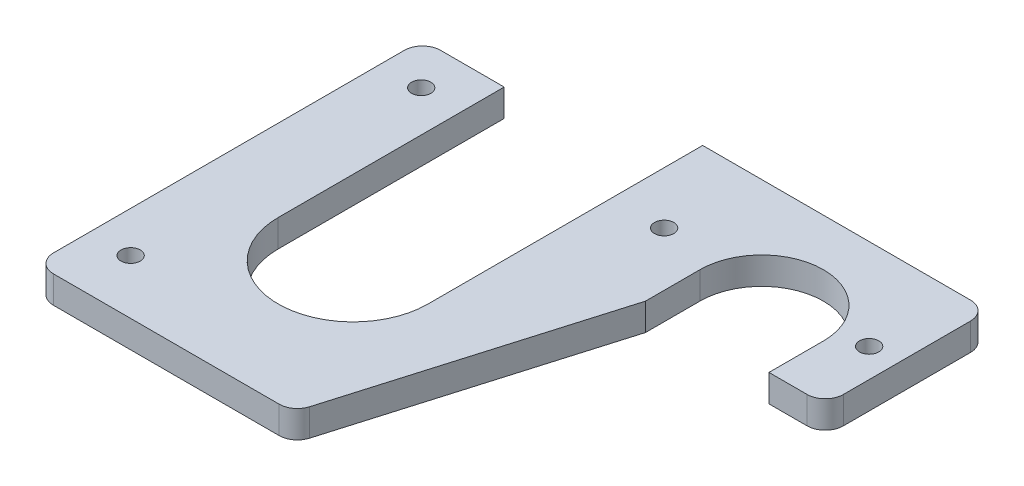
ISO-10303-21;
HEADER;
FILE_DESCRIPTION(('STEP AP214'),'2;1');
FILE_NAME('part.step','',(''),(''),'','','');
FILE_SCHEMA(('AUTOMOTIVE_DESIGN { 1 0 10303 214 1 1 1 1 }'));
ENDSEC;
DATA;
#1=APPLICATION_CONTEXT('core data for automotive mechanical design processes');
#2=APPLICATION_PROTOCOL_DEFINITION('international standard','automotive_design',2000,#1);
#3=PRODUCT_CONTEXT('',#1,'mechanical');
#4=PRODUCT('Part','Part','',(#3));
#5=PRODUCT_RELATED_PRODUCT_CATEGORY('part','',(#4));
#6=PRODUCT_DEFINITION_FORMATION('','',#4);
#7=PRODUCT_DEFINITION_CONTEXT('part definition',#1,'design');
#8=PRODUCT_DEFINITION('design','',#6,#7);
#9=PRODUCT_DEFINITION_SHAPE('','',#8);
#10=(LENGTH_UNIT() NAMED_UNIT(*) SI_UNIT(.MILLI.,.METRE.));
#11=(NAMED_UNIT(*) PLANE_ANGLE_UNIT() SI_UNIT($,.RADIAN.));
#12=(NAMED_UNIT(*) SI_UNIT($,.STERADIAN.) SOLID_ANGLE_UNIT());
#13=UNCERTAINTY_MEASURE_WITH_UNIT(LENGTH_MEASURE(1.E-05),#10,'distance_accuracy_value','');
#14=(GEOMETRIC_REPRESENTATION_CONTEXT(3) GLOBAL_UNCERTAINTY_ASSIGNED_CONTEXT((#13)) GLOBAL_UNIT_ASSIGNED_CONTEXT((#10,
#11,#12)) REPRESENTATION_CONTEXT('',''));
#15=CARTESIAN_POINT('',(0.,0.,0.));
#16=DIRECTION('',(0.,0.,1.));
#17=DIRECTION('',(1.,0.,0.));
#18=AXIS2_PLACEMENT_3D('',#15,#16,#17);
#19=CARTESIAN_POINT('',(82.55,9.525,0.));
#20=DIRECTION('',(-0.959204567325331,0.,-0.282712925106413));
#21=DIRECTION('',(-0.282712925106413,0.,0.959204567325331));
#22=AXIS2_PLACEMENT_3D('',#19,#20,#21);
#23=PLANE('',#22);
#24=DIRECTION('',(0.282712925106413,0.,-0.959204567325331));
#25=VECTOR('',#24,1.);
#26=CARTESIAN_POINT('',(82.55,9.525,0.));
#27=LINE('',#26,#25);
#28=CARTESIAN_POINT('',(91.378775178064,9.525,-29.9547729255743));
#29=VERTEX_POINT('',#28);
#30=CARTESIAN_POINT('',(118.11,9.525,-120.65));
#31=VERTEX_POINT('',#30);
#32=EDGE_CURVE('E157',#29,#31,#27,.T.);
#33=ORIENTED_EDGE('',*,*,#32,.F.);
#34=DIRECTION('',(0.,-1.,0.));
#35=VECTOR('',#34,1.);
#36=CARTESIAN_POINT('',(91.378775178064,9.525,-29.9547729255743));
#37=LINE('',#36,#35);
#38=CARTESIAN_POINT('',(91.378775178064,0.,-29.9547729255743));
#39=VERTEX_POINT('',#38);
#40=EDGE_CURVE('E285',#29,#39,#37,.T.);
#41=ORIENTED_EDGE('',*,*,#40,.T.);
#42=DIRECTION('',(0.282712925106413,0.,-0.959204567325331));
#43=VECTOR('',#42,1.);
#44=CARTESIAN_POINT('',(82.55,0.,0.));
#45=LINE('',#44,#43);
#46=CARTESIAN_POINT('',(118.11,0.,-120.65));
#47=VERTEX_POINT('',#46);
#48=EDGE_CURVE('E175',#39,#47,#45,.T.);
#49=ORIENTED_EDGE('',*,*,#48,.T.);
#50=DIRECTION('',(0.,-1.,0.));
#51=VECTOR('',#50,1.);
#52=CARTESIAN_POINT('',(118.11,9.525,-120.65));
#53=LINE('',#52,#51);
#54=EDGE_CURVE('E173',#31,#47,#53,.T.);
#55=ORIENTED_EDGE('',*,*,#54,.F.);
#56=EDGE_LOOP('',(#33,#41,#49,#55));
#57=FACE_BOUND('',#56,.T.);
#58=ADVANCED_FACE('F33',(#57),#23,.F.);
#59=CARTESIAN_POINT('',(118.11,9.525,-139.7));
#60=DIRECTION('',(-1.,0.,0.));
#61=DIRECTION('',(0.,0.,1.));
#62=AXIS2_PLACEMENT_3D('',#59,#60,#61);
#63=PLANE('',#62);
#64=DIRECTION('',(0.,0.,-1.));
#65=VECTOR('',#64,1.);
#66=CARTESIAN_POINT('',(118.11,0.,-139.7));
#67=LINE('',#66,#65);
#68=CARTESIAN_POINT('',(118.11,0.,-139.7));
#69=VERTEX_POINT('',#68);
#70=EDGE_CURVE('E209',#47,#69,#67,.T.);
#71=ORIENTED_EDGE('',*,*,#70,.T.);
#72=DIRECTION('',(0.,-1.,0.));
#73=VECTOR('',#72,1.);
#74=CARTESIAN_POINT('',(118.11,9.525,-139.7));
#75=LINE('',#74,#73);
#76=CARTESIAN_POINT('',(118.11,9.525,-139.7));
#77=VERTEX_POINT('',#76);
#78=EDGE_CURVE('E179',#77,#69,#75,.T.);
#79=ORIENTED_EDGE('',*,*,#78,.F.);
#80=DIRECTION('',(0.,0.,-1.));
#81=VECTOR('',#80,1.);
#82=CARTESIAN_POINT('',(118.11,9.525,-139.7));
#83=LINE('',#82,#81);
#84=EDGE_CURVE('E162',#31,#77,#83,.T.);
#85=ORIENTED_EDGE('',*,*,#84,.F.);
#86=ORIENTED_EDGE('',*,*,#54,.T.);
#87=EDGE_LOOP('',(#71,#79,#85,#86));
#88=FACE_BOUND('',#87,.T.);
#89=ADVANCED_FACE('F181',(#88),#63,.F.);
#90=CARTESIAN_POINT('',(139.7,9.525,-139.7));
#91=DIRECTION('',(0.,-1.,0.));
#92=DIRECTION('',(0.,0.,-1.));
#93=AXIS2_PLACEMENT_3D('',#90,#91,#92);
#94=CYLINDRICAL_SURFACE('',#93,21.59);
#95=CARTESIAN_POINT('',(139.7,0.,-139.7));
#96=DIRECTION('',(0.,-1.,0.));
#97=DIRECTION('',(0.,0.,1.));
#98=AXIS2_PLACEMENT_3D('',#95,#96,#97);
#99=CIRCLE('',#98,21.59);
#100=CARTESIAN_POINT('',(161.29,0.,-139.7));
#101=VERTEX_POINT('',#100);
#102=EDGE_CURVE('E212',#69,#101,#99,.T.);
#103=ORIENTED_EDGE('',*,*,#102,.T.);
#104=DIRECTION('',(0.,-1.,0.));
#105=VECTOR('',#104,1.);
#106=CARTESIAN_POINT('',(161.29,9.525,-139.7));
#107=LINE('',#106,#105);
#108=CARTESIAN_POINT('',(161.29,9.525,-139.7));
#109=VERTEX_POINT('',#108);
#110=EDGE_CURVE('E247',#109,#101,#107,.T.);
#111=ORIENTED_EDGE('',*,*,#110,.F.);
#112=CARTESIAN_POINT('',(139.7,9.525,-139.7));
#113=DIRECTION('',(0.,-1.,0.));
#114=DIRECTION('',(0.,0.,1.));
#115=AXIS2_PLACEMENT_3D('',#112,#113,#114);
#116=CIRCLE('',#115,21.59);
#117=EDGE_CURVE('E184',#77,#109,#116,.T.);
#118=ORIENTED_EDGE('',*,*,#117,.F.);
#119=ORIENTED_EDGE('',*,*,#78,.T.);
#120=EDGE_LOOP('',(#103,#111,#118,#119));
#121=FACE_BOUND('',#120,.T.);
#122=ADVANCED_FACE('F327',(#121),#94,.F.);
#123=CARTESIAN_POINT('',(161.29,9.525,-139.7));
#124=DIRECTION('',(1.,0.,0.));
#125=DIRECTION('',(0.,0.,-1.));
#126=AXIS2_PLACEMENT_3D('',#123,#124,#125);
#127=PLANE('',#126);
#128=DIRECTION('',(0.,0.,1.));
#129=VECTOR('',#128,1.);
#130=CARTESIAN_POINT('',(161.29,0.,-139.7));
#131=LINE('',#130,#129);
#132=CARTESIAN_POINT('',(161.29,0.,-120.65));
#133=VERTEX_POINT('',#132);
#134=EDGE_CURVE('E214',#101,#133,#131,.T.);
#135=ORIENTED_EDGE('',*,*,#134,.T.);
#136=DIRECTION('',(0.,-1.,0.));
#137=VECTOR('',#136,1.);
#138=CARTESIAN_POINT('',(161.29,9.525,-120.65));
#139=LINE('',#138,#137);
#140=CARTESIAN_POINT('',(161.29,9.525,-120.65));
#141=VERTEX_POINT('',#140);
#142=EDGE_CURVE('E244',#141,#133,#139,.T.);
#143=ORIENTED_EDGE('',*,*,#142,.F.);
#144=DIRECTION('',(0.,0.,1.));
#145=VECTOR('',#144,1.);
#146=CARTESIAN_POINT('',(161.29,9.525,-139.7));
#147=LINE('',#146,#145);
#148=EDGE_CURVE('E186',#109,#141,#147,.T.);
#149=ORIENTED_EDGE('',*,*,#148,.F.);
#150=ORIENTED_EDGE('',*,*,#110,.T.);
#151=EDGE_LOOP('',(#135,#143,#149,#150));
#152=FACE_BOUND('',#151,.T.);
#153=ADVANCED_FACE('F352',(#152),#127,.F.);
#154=CARTESIAN_POINT('',(180.975,9.525,-120.65));
#155=DIRECTION('',(0.,0.,-1.));
#156=DIRECTION('',(-1.,0.,0.));
#157=AXIS2_PLACEMENT_3D('',#154,#155,#156);
#158=PLANE('',#157);
#159=DIRECTION('',(1.,0.,0.));
#160=VECTOR('',#159,1.);
#161=CARTESIAN_POINT('',(180.975,0.,-120.65));
#162=LINE('',#161,#160);
#163=CARTESIAN_POINT('',(174.625,0.,-120.65));
#164=VERTEX_POINT('',#163);
#165=EDGE_CURVE('E216',#133,#164,#162,.T.);
#166=ORIENTED_EDGE('',*,*,#165,.T.);
#167=DIRECTION('',(0.,-1.,0.));
#168=VECTOR('',#167,1.);
#169=CARTESIAN_POINT('',(174.625,9.525,-120.65));
#170=LINE('',#169,#168);
#171=CARTESIAN_POINT('',(174.625,9.525,-120.65));
#172=VERTEX_POINT('',#171);
#173=EDGE_CURVE('E277',#164,#172,#170,.F.);
#174=ORIENTED_EDGE('',*,*,#173,.T.);
#175=DIRECTION('',(1.,0.,0.));
#176=VECTOR('',#175,1.);
#177=CARTESIAN_POINT('',(180.975,9.525,-120.65));
#178=LINE('',#177,#176);
#179=EDGE_CURVE('E191',#141,#172,#178,.T.);
#180=ORIENTED_EDGE('',*,*,#179,.F.);
#181=ORIENTED_EDGE('',*,*,#142,.T.);
#182=EDGE_LOOP('',(#166,#174,#180,#181));
#183=FACE_BOUND('',#182,.T.);
#184=ADVANCED_FACE('F355',(#183),#158,.F.);
#185=CARTESIAN_POINT('',(180.975,9.525,-139.7));
#186=DIRECTION('',(-1.,0.,0.));
#187=DIRECTION('',(0.,0.,1.));
#188=AXIS2_PLACEMENT_3D('',#185,#186,#187);
#189=PLANE('',#188);
#190=DIRECTION('',(0.,0.,-1.));
#191=VECTOR('',#190,1.);
#192=CARTESIAN_POINT('',(180.975,9.525,-139.7));
#193=LINE('',#192,#191);
#194=CARTESIAN_POINT('',(180.975,9.525,-127.));
#195=VERTEX_POINT('',#194);
#196=CARTESIAN_POINT('',(180.975,9.525,-171.45));
#197=VERTEX_POINT('',#196);
#198=EDGE_CURVE('E193',#195,#197,#193,.T.);
#199=ORIENTED_EDGE('',*,*,#198,.F.);
#200=DIRECTION('',(0.,-1.,0.));
#201=VECTOR('',#200,1.);
#202=CARTESIAN_POINT('',(180.975,9.525,-127.));
#203=LINE('',#202,#201);
#204=CARTESIAN_POINT('',(180.975,0.,-127.));
#205=VERTEX_POINT('',#204);
#206=EDGE_CURVE('E266',#195,#205,#203,.T.);
#207=ORIENTED_EDGE('',*,*,#206,.T.);
#208=DIRECTION('',(0.,0.,-1.));
#209=VECTOR('',#208,1.);
#210=CARTESIAN_POINT('',(180.975,0.,-139.7));
#211=LINE('',#210,#209);
#212=CARTESIAN_POINT('',(180.975,0.,-171.45));
#213=VERTEX_POINT('',#212);
#214=EDGE_CURVE('E219',#205,#213,#211,.T.);
#215=ORIENTED_EDGE('',*,*,#214,.T.);
#216=DIRECTION('',(0.,-1.,0.));
#217=VECTOR('',#216,1.);
#218=CARTESIAN_POINT('',(180.975,9.525,-171.45));
#219=LINE('',#218,#217);
#220=EDGE_CURVE('E264',#213,#197,#219,.F.);
#221=ORIENTED_EDGE('',*,*,#220,.T.);
#222=EDGE_LOOP('',(#199,#207,#215,#221));
#223=FACE_BOUND('',#222,.T.);
#224=ADVANCED_FACE('F360',(#223),#189,.F.);
#225=CARTESIAN_POINT('',(80.9625,9.525,-177.8));
#226=DIRECTION('',(0.,0.,1.));
#227=DIRECTION('',(1.,0.,0.));
#228=AXIS2_PLACEMENT_3D('',#225,#226,#227);
#229=PLANE('',#228);
#230=DIRECTION('',(-1.,0.,0.));
#231=VECTOR('',#230,1.);
#232=CARTESIAN_POINT('',(180.975,9.525,-177.8));
#233=LINE('',#232,#231);
#234=CARTESIAN_POINT('',(174.625,9.525,-177.8));
#235=VERTEX_POINT('',#234);
#236=CARTESIAN_POINT('',(80.9625,9.525,-177.8));
#237=VERTEX_POINT('',#236);
#238=EDGE_CURVE('E195',#235,#237,#233,.T.);
#239=ORIENTED_EDGE('',*,*,#238,.F.);
#240=DIRECTION('',(0.,-1.,0.));
#241=VECTOR('',#240,1.);
#242=CARTESIAN_POINT('',(174.625,9.525,-177.8));
#243=LINE('',#242,#241);
#244=CARTESIAN_POINT('',(174.625,0.,-177.8));
#245=VERTEX_POINT('',#244);
#246=EDGE_CURVE('E289',#235,#245,#243,.T.);
#247=ORIENTED_EDGE('',*,*,#246,.T.);
#248=DIRECTION('',(-1.,0.,0.));
#249=VECTOR('',#248,1.);
#250=CARTESIAN_POINT('',(80.9625,0.,-177.8));
#251=LINE('',#250,#249);
#252=CARTESIAN_POINT('',(80.9625,0.,-177.8));
#253=VERTEX_POINT('',#252);
#254=EDGE_CURVE('E222',#245,#253,#251,.T.);
#255=ORIENTED_EDGE('',*,*,#254,.T.);
#256=DIRECTION('',(0.,-1.,0.));
#257=VECTOR('',#256,1.);
#258=CARTESIAN_POINT('',(80.9625,9.525,-177.8));
#259=LINE('',#258,#257);
#260=EDGE_CURVE('E241',#237,#253,#259,.T.);
#261=ORIENTED_EDGE('',*,*,#260,.F.);
#262=EDGE_LOOP('',(#239,#247,#255,#261));
#263=FACE_BOUND('',#262,.T.);
#264=ADVANCED_FACE('F365',(#263),#229,.F.);
#265=CARTESIAN_POINT('',(80.9625,9.525,-81.75625));
#266=DIRECTION('',(1.,0.,0.));
#267=DIRECTION('',(0.,0.,-1.));
#268=AXIS2_PLACEMENT_3D('',#265,#266,#267);
#269=PLANE('',#268);
#270=DIRECTION('',(0.,0.,1.));
#271=VECTOR('',#270,1.);
#272=CARTESIAN_POINT('',(80.9625,0.,-81.75625));
#273=LINE('',#272,#271);
#274=CARTESIAN_POINT('',(80.9625,0.,-81.75625));
#275=VERTEX_POINT('',#274);
#276=EDGE_CURVE('E224',#253,#275,#273,.T.);
#277=ORIENTED_EDGE('',*,*,#276,.T.);
#278=DIRECTION('',(0.,-1.,0.));
#279=VECTOR('',#278,1.);
#280=CARTESIAN_POINT('',(80.9625,9.525,-81.75625));
#281=LINE('',#280,#279);
#282=CARTESIAN_POINT('',(80.9625,9.525,-81.75625));
#283=VERTEX_POINT('',#282);
#284=EDGE_CURVE('E238',#283,#275,#281,.T.);
#285=ORIENTED_EDGE('',*,*,#284,.F.);
#286=DIRECTION('',(0.,0.,1.));
#287=VECTOR('',#286,1.);
#288=CARTESIAN_POINT('',(80.9625,9.525,-81.75625));
#289=LINE('',#288,#287);
#290=EDGE_CURVE('E197',#237,#283,#289,.T.);
#291=ORIENTED_EDGE('',*,*,#290,.F.);
#292=ORIENTED_EDGE('',*,*,#260,.T.);
#293=EDGE_LOOP('',(#277,#285,#291,#292));
#294=FACE_BOUND('',#293,.T.);
#295=ADVANCED_FACE('F372',(#294),#269,.F.);
#296=CARTESIAN_POINT('',(54.76875,9.525,-81.75625));
#297=DIRECTION('',(0.,-1.,0.));
#298=DIRECTION('',(0.,0.,-1.));
#299=AXIS2_PLACEMENT_3D('',#296,#297,#298);
#300=CYLINDRICAL_SURFACE('',#299,26.19375);
#301=CARTESIAN_POINT('',(54.76875,0.,-81.75625));
#302=DIRECTION('',(0.,-1.,0.));
#303=DIRECTION('',(0.,0.,1.));
#304=AXIS2_PLACEMENT_3D('',#301,#302,#303);
#305=CIRCLE('',#304,26.19375);
#306=CARTESIAN_POINT('',(28.575,0.,-81.75625));
#307=VERTEX_POINT('',#306);
#308=EDGE_CURVE('E226',#275,#307,#305,.T.);
#309=ORIENTED_EDGE('',*,*,#308,.T.);
#310=DIRECTION('',(0.,-1.,0.));
#311=VECTOR('',#310,1.);
#312=CARTESIAN_POINT('',(28.575,9.525,-81.75625));
#313=LINE('',#312,#311);
#314=CARTESIAN_POINT('',(28.575,9.525,-81.75625));
#315=VERTEX_POINT('',#314);
#316=EDGE_CURVE('E235',#315,#307,#313,.T.);
#317=ORIENTED_EDGE('',*,*,#316,.F.);
#318=CARTESIAN_POINT('',(54.76875,9.525,-81.75625));
#319=DIRECTION('',(0.,-1.,0.));
#320=DIRECTION('',(0.,0.,1.));
#321=AXIS2_PLACEMENT_3D('',#318,#319,#320);
#322=CIRCLE('',#321,26.19375);
#323=EDGE_CURVE('E199',#283,#315,#322,.T.);
#324=ORIENTED_EDGE('',*,*,#323,.F.);
#325=ORIENTED_EDGE('',*,*,#284,.T.);
#326=EDGE_LOOP('',(#309,#317,#324,#325));
#327=FACE_BOUND('',#326,.T.);
#328=ADVANCED_FACE('F376',(#327),#300,.F.);
#329=CARTESIAN_POINT('',(28.575,9.525,-81.75625));
#330=DIRECTION('',(-1.,0.,0.));
#331=DIRECTION('',(0.,0.,1.));
#332=AXIS2_PLACEMENT_3D('',#329,#330,#331);
#333=PLANE('',#332);
#334=DIRECTION('',(0.,0.,-1.));
#335=VECTOR('',#334,1.);
#336=CARTESIAN_POINT('',(28.575,0.,-81.75625));
#337=LINE('',#336,#335);
#338=CARTESIAN_POINT('',(28.575,0.,-160.782));
#339=VERTEX_POINT('',#338);
#340=EDGE_CURVE('E228',#307,#339,#337,.T.);
#341=ORIENTED_EDGE('',*,*,#340,.T.);
#342=DIRECTION('',(0.,-1.,0.));
#343=VECTOR('',#342,1.);
#344=CARTESIAN_POINT('',(28.575,9.525,-160.782));
#345=LINE('',#344,#343);
#346=CARTESIAN_POINT('',(28.575,9.525,-160.782));
#347=VERTEX_POINT('',#346);
#348=EDGE_CURVE('E207',#347,#339,#345,.T.);
#349=ORIENTED_EDGE('',*,*,#348,.F.);
#350=DIRECTION('',(0.,0.,-1.));
#351=VECTOR('',#350,1.);
#352=CARTESIAN_POINT('',(28.575,9.525,-81.75625));
#353=LINE('',#352,#351);
#354=EDGE_CURVE('E201',#315,#347,#353,.T.);
#355=ORIENTED_EDGE('',*,*,#354,.F.);
#356=ORIENTED_EDGE('',*,*,#316,.T.);
#357=EDGE_LOOP('',(#341,#349,#355,#356));
#358=FACE_BOUND('',#357,.T.);
#359=ADVANCED_FACE('F381',(#358),#333,.F.);
#360=CARTESIAN_POINT('',(0.,9.525,-160.782));
#361=DIRECTION('',(0.,0.,1.));
#362=DIRECTION('',(1.,0.,0.));
#363=AXIS2_PLACEMENT_3D('',#360,#361,#362);
#364=PLANE('',#363);
#365=DIRECTION('',(-1.,0.,0.));
#366=VECTOR('',#365,1.);
#367=CARTESIAN_POINT('',(0.,0.,-160.782));
#368=LINE('',#367,#366);
#369=CARTESIAN_POINT('',(6.35,0.,-160.782));
#370=VERTEX_POINT('',#369);
#371=EDGE_CURVE('E230',#339,#370,#368,.T.);
#372=ORIENTED_EDGE('',*,*,#371,.T.);
#373=DIRECTION('',(0.,-1.,0.));
#374=VECTOR('',#373,1.);
#375=CARTESIAN_POINT('',(6.35,9.525,-160.782));
#376=LINE('',#375,#374);
#377=CARTESIAN_POINT('',(6.35,9.525,-160.782));
#378=VERTEX_POINT('',#377);
#379=EDGE_CURVE('E11',#370,#378,#376,.F.);
#380=ORIENTED_EDGE('',*,*,#379,.T.);
#381=DIRECTION('',(-1.,0.,0.));
#382=VECTOR('',#381,1.);
#383=CARTESIAN_POINT('',(0.,9.525,-160.782));
#384=LINE('',#383,#382);
#385=EDGE_CURVE('E203',#347,#378,#384,.T.);
#386=ORIENTED_EDGE('',*,*,#385,.F.);
#387=ORIENTED_EDGE('',*,*,#348,.T.);
#388=EDGE_LOOP('',(#372,#380,#386,#387));
#389=FACE_BOUND('',#388,.T.);
#390=ADVANCED_FACE('F382',(#389),#364,.F.);
#391=CARTESIAN_POINT('',(0.,9.525,-160.782));
#392=DIRECTION('',(1.,0.,0.));
#393=DIRECTION('',(0.,0.,-1.));
#394=AXIS2_PLACEMENT_3D('',#391,#392,#393);
#395=PLANE('',#394);
#396=DIRECTION('',(0.,0.,1.));
#397=VECTOR('',#396,1.);
#398=CARTESIAN_POINT('',(0.,9.525,-160.782));
#399=LINE('',#398,#397);
#400=CARTESIAN_POINT('',(0.,9.525,-154.432));
#401=VERTEX_POINT('',#400);
#402=CARTESIAN_POINT('',(0.,9.525,-31.75));
#403=VERTEX_POINT('',#402);
#404=EDGE_CURVE('E205',#401,#403,#399,.T.);
#405=ORIENTED_EDGE('',*,*,#404,.F.);
#406=DIRECTION('',(0.,-1.,0.));
#407=VECTOR('',#406,1.);
#408=CARTESIAN_POINT('',(0.,9.525,-154.432));
#409=LINE('',#408,#407);
#410=CARTESIAN_POINT('',(0.,0.,-154.432));
#411=VERTEX_POINT('',#410);
#412=EDGE_CURVE('E41',#401,#411,#409,.T.);
#413=ORIENTED_EDGE('',*,*,#412,.T.);
#414=DIRECTION('',(0.,0.,1.));
#415=VECTOR('',#414,1.);
#416=CARTESIAN_POINT('',(0.,0.,-160.782));
#417=LINE('',#416,#415);
#418=CARTESIAN_POINT('',(0.,0.,-31.75));
#419=VERTEX_POINT('',#418);
#420=EDGE_CURVE('E170',#411,#419,#417,.T.);
#421=ORIENTED_EDGE('',*,*,#420,.T.);
#422=DIRECTION('',(0.,1.,0.));
#423=VECTOR('',#422,1.);
#424=CARTESIAN_POINT('',(0.,9.525,-31.75));
#425=LINE('',#424,#423);
#426=EDGE_CURVE('E252',#419,#403,#425,.T.);
#427=ORIENTED_EDGE('',*,*,#426,.T.);
#428=EDGE_LOOP('',(#405,#413,#421,#427));
#429=FACE_BOUND('',#428,.T.);
#430=ADVANCED_FACE('F296',(#429),#395,.F.);
#431=CARTESIAN_POINT('',(139.7,9.525,-139.7));
#432=DIRECTION('',(0.,1.,0.));
#433=DIRECTION('',(0.,0.,1.));
#434=AXIS2_PLACEMENT_3D('',#431,#432,#433);
#435=PLANE('',#434);
#436=CARTESIAN_POINT('',(14.2875,9.525,-146.05));
#437=DIRECTION('',(0.,1.,0.));
#438=DIRECTION('',(0.,0.,1.));
#439=AXIS2_PLACEMENT_3D('',#436,#437,#438);
#440=CIRCLE('',#439,3.37819999999999);
#441=CARTESIAN_POINT('',(14.2875,9.525,-142.6718));
#442=VERTEX_POINT('',#441);
#443=EDGE_CURVE('E581',#442,#442,#440,.T.);
#444=ORIENTED_EDGE('',*,*,#443,.F.);
#445=EDGE_LOOP('',(#444));
#446=FACE_BOUND('',#445,.T.);
#447=CARTESIAN_POINT('',(14.2875,9.525,-44.45));
#448=DIRECTION('',(0.,1.,0.));
#449=DIRECTION('',(0.,0.,1.));
#450=AXIS2_PLACEMENT_3D('',#447,#448,#449);
#451=CIRCLE('',#450,3.37819999999999);
#452=CARTESIAN_POINT('',(14.2875,9.525,-41.0718));
#453=VERTEX_POINT('',#452);
#454=EDGE_CURVE('E575',#453,#453,#451,.T.);
#455=ORIENTED_EDGE('',*,*,#454,.F.);
#456=EDGE_LOOP('',(#455));
#457=FACE_BOUND('',#456,.T.);
#458=CARTESIAN_POINT('',(99.2378,9.525,-146.05));
#459=DIRECTION('',(0.,1.,0.));
#460=DIRECTION('',(0.,0.,1.));
#461=AXIS2_PLACEMENT_3D('',#458,#459,#460);
#462=CIRCLE('',#461,3.37819999999998);
#463=CARTESIAN_POINT('',(99.2378,9.525,-142.6718));
#464=VERTEX_POINT('',#463);
#465=EDGE_CURVE('E569',#464,#464,#462,.T.);
#466=ORIENTED_EDGE('',*,*,#465,.F.);
#467=EDGE_LOOP('',(#466));
#468=FACE_BOUND('',#467,.T.);
#469=CARTESIAN_POINT('',(170.92295,9.525,-146.05));
#470=DIRECTION('',(0.,1.,0.));
#471=DIRECTION('',(0.,0.,1.));
#472=AXIS2_PLACEMENT_3D('',#469,#470,#471);
#473=CIRCLE('',#472,3.3782);
#474=CARTESIAN_POINT('',(170.92295,9.525,-142.6718));
#475=VERTEX_POINT('',#474);
#476=EDGE_CURVE('E561',#475,#475,#473,.T.);
#477=ORIENTED_EDGE('',*,*,#476,.F.);
#478=EDGE_LOOP('',(#477));
#479=FACE_BOUND('',#478,.T.);
#480=ORIENTED_EDGE('',*,*,#179,.T.);
#481=CARTESIAN_POINT('',(174.625,9.525,-127.));
#482=DIRECTION('',(0.,1.,0.));
#483=DIRECTION('',(0.,0.,1.));
#484=AXIS2_PLACEMENT_3D('',#481,#482,#483);
#485=CIRCLE('',#484,6.35);
#486=EDGE_CURVE('E283',#172,#195,#485,.T.);
#487=ORIENTED_EDGE('',*,*,#486,.T.);
#488=ORIENTED_EDGE('',*,*,#198,.T.);
#489=CARTESIAN_POINT('',(174.625,9.525,-171.45));
#490=DIRECTION('',(0.,1.,0.));
#491=DIRECTION('',(0.,0.,1.));
#492=AXIS2_PLACEMENT_3D('',#489,#490,#491);
#493=CIRCLE('',#492,6.35);
#494=EDGE_CURVE('E54',#197,#235,#493,.T.);
#495=ORIENTED_EDGE('',*,*,#494,.T.);
#496=ORIENTED_EDGE('',*,*,#238,.T.);
#497=ORIENTED_EDGE('',*,*,#290,.T.);
#498=ORIENTED_EDGE('',*,*,#323,.T.);
#499=ORIENTED_EDGE('',*,*,#354,.T.);
#500=ORIENTED_EDGE('',*,*,#385,.T.);
#501=CARTESIAN_POINT('',(6.35,9.525,-154.432));
#502=DIRECTION('',(0.,1.,0.));
#503=DIRECTION('',(0.,0.,1.));
#504=AXIS2_PLACEMENT_3D('',#501,#502,#503);
#505=CIRCLE('',#504,6.35);
#506=EDGE_CURVE('E279',#378,#401,#505,.T.);
#507=ORIENTED_EDGE('',*,*,#506,.T.);
#508=ORIENTED_EDGE('',*,*,#404,.T.);
#509=CARTESIAN_POINT('',(6.35,9.525,-31.75));
#510=DIRECTION('',(0.,1.,0.));
#511=DIRECTION('',(0.,0.,1.));
#512=AXIS2_PLACEMENT_3D('',#509,#510,#511);
#513=CIRCLE('',#512,6.35);
#514=CARTESIAN_POINT('',(6.35,9.525,-25.4));
#515=VERTEX_POINT('',#514);
#516=EDGE_CURVE('E255',#403,#515,#513,.T.);
#517=ORIENTED_EDGE('',*,*,#516,.T.);
#518=DIRECTION('',(-1.,0.,0.));
#519=VECTOR('',#518,1.);
#520=CARTESIAN_POINT('',(0.,9.525,-25.4));
#521=LINE('',#520,#519);
#522=CARTESIAN_POINT('',(85.2878261755481,9.525,-25.4));
#523=VERTEX_POINT('',#522);
#524=EDGE_CURVE('E210',#523,#515,#521,.T.);
#525=ORIENTED_EDGE('',*,*,#524,.F.);
#526=CARTESIAN_POINT('',(85.2878261755481,9.525,-31.75));
#527=DIRECTION('',(0.,1.,0.));
#528=DIRECTION('',(0.,0.,1.));
#529=AXIS2_PLACEMENT_3D('',#526,#527,#528);
#530=CIRCLE('',#529,6.35);
#531=EDGE_CURVE('E166',#523,#29,#530,.T.);
#532=ORIENTED_EDGE('',*,*,#531,.T.);
#533=ORIENTED_EDGE('',*,*,#32,.T.);
#534=ORIENTED_EDGE('',*,*,#84,.T.);
#535=ORIENTED_EDGE('',*,*,#117,.T.);
#536=ORIENTED_EDGE('',*,*,#148,.T.);
#537=EDGE_LOOP('',(#480,#487,#488,#495,#496,#497,#498,#499,#500,#507,#508,#517,#525,#532,#533,
#534,#535,#536));
#538=FACE_BOUND('',#537,.T.);
#539=ADVANCED_FACE('F160',(#446,#457,#468,#479,#538),#435,.T.);
#540=CARTESIAN_POINT('',(139.7,0.,-139.7));
#541=DIRECTION('',(0.,1.,0.));
#542=DIRECTION('',(0.,0.,1.));
#543=AXIS2_PLACEMENT_3D('',#540,#541,#542);
#544=PLANE('',#543);
#545=CARTESIAN_POINT('',(14.2875,0.,-146.05));
#546=DIRECTION('',(0.,1.,0.));
#547=DIRECTION('',(0.,0.,1.));
#548=AXIS2_PLACEMENT_3D('',#545,#546,#547);
#549=CIRCLE('',#548,3.3782);
#550=CARTESIAN_POINT('',(14.2875,0.,-142.6718));
#551=VERTEX_POINT('',#550);
#552=EDGE_CURVE('E578',#551,#551,#549,.T.);
#553=ORIENTED_EDGE('',*,*,#552,.T.);
#554=EDGE_LOOP('',(#553));
#555=FACE_BOUND('',#554,.T.);
#556=CARTESIAN_POINT('',(14.2875,0.,-44.45));
#557=DIRECTION('',(0.,1.,0.));
#558=DIRECTION('',(0.,0.,1.));
#559=AXIS2_PLACEMENT_3D('',#556,#557,#558);
#560=CIRCLE('',#559,3.3782);
#561=CARTESIAN_POINT('',(14.2875,0.,-41.0718));
#562=VERTEX_POINT('',#561);
#563=EDGE_CURVE('E572',#562,#562,#560,.T.);
#564=ORIENTED_EDGE('',*,*,#563,.T.);
#565=EDGE_LOOP('',(#564));
#566=FACE_BOUND('',#565,.T.);
#567=CARTESIAN_POINT('',(99.2378,0.,-146.05));
#568=DIRECTION('',(0.,1.,0.));
#569=DIRECTION('',(0.,0.,1.));
#570=AXIS2_PLACEMENT_3D('',#567,#568,#569);
#571=CIRCLE('',#570,3.3782);
#572=CARTESIAN_POINT('',(99.2378,0.,-142.6718));
#573=VERTEX_POINT('',#572);
#574=EDGE_CURVE('E566',#573,#573,#571,.T.);
#575=ORIENTED_EDGE('',*,*,#574,.T.);
#576=EDGE_LOOP('',(#575));
#577=FACE_BOUND('',#576,.T.);
#578=CARTESIAN_POINT('',(170.92295,0.,-146.05));
#579=DIRECTION('',(0.,1.,0.));
#580=DIRECTION('',(0.,0.,1.));
#581=AXIS2_PLACEMENT_3D('',#578,#579,#580);
#582=CIRCLE('',#581,3.3782);
#583=CARTESIAN_POINT('',(170.92295,0.,-142.6718));
#584=VERTEX_POINT('',#583);
#585=EDGE_CURVE('E559',#584,#584,#582,.T.);
#586=ORIENTED_EDGE('',*,*,#585,.T.);
#587=EDGE_LOOP('',(#586));
#588=FACE_BOUND('',#587,.T.);
#589=ORIENTED_EDGE('',*,*,#214,.F.);
#590=CARTESIAN_POINT('',(174.625,0.,-127.));
#591=DIRECTION('',(0.,1.,0.));
#592=DIRECTION('',(0.,0.,1.));
#593=AXIS2_PLACEMENT_3D('',#590,#591,#592);
#594=CIRCLE('',#593,6.35);
#595=EDGE_CURVE('E275',#205,#164,#594,.F.);
#596=ORIENTED_EDGE('',*,*,#595,.T.);
#597=ORIENTED_EDGE('',*,*,#165,.F.);
#598=ORIENTED_EDGE('',*,*,#134,.F.);
#599=ORIENTED_EDGE('',*,*,#102,.F.);
#600=ORIENTED_EDGE('',*,*,#70,.F.);
#601=ORIENTED_EDGE('',*,*,#48,.F.);
#602=CARTESIAN_POINT('',(85.2878261755481,0.,-31.75));
#603=DIRECTION('',(0.,1.,0.));
#604=DIRECTION('',(0.,0.,1.));
#605=AXIS2_PLACEMENT_3D('',#602,#603,#604);
#606=CIRCLE('',#605,6.35);
#607=CARTESIAN_POINT('',(85.2878261755481,0.,-25.4));
#608=VERTEX_POINT('',#607);
#609=EDGE_CURVE('E273',#39,#608,#606,.F.);
#610=ORIENTED_EDGE('',*,*,#609,.T.);
#611=DIRECTION('',(-1.,0.,0.));
#612=VECTOR('',#611,1.);
#613=CARTESIAN_POINT('',(139.7,0.,-25.4));
#614=LINE('',#613,#612);
#615=CARTESIAN_POINT('',(6.34999999999999,0.,-25.4));
#616=VERTEX_POINT('',#615);
#617=EDGE_CURVE('E178',#608,#616,#614,.T.);
#618=ORIENTED_EDGE('',*,*,#617,.T.);
#619=CARTESIAN_POINT('',(6.35,0.,-31.75));
#620=DIRECTION('',(0.,1.,0.));
#621=DIRECTION('',(0.,0.,1.));
#622=AXIS2_PLACEMENT_3D('',#619,#620,#621);
#623=CIRCLE('',#622,6.35);
#624=EDGE_CURVE('E261',#616,#419,#623,.F.);
#625=ORIENTED_EDGE('',*,*,#624,.T.);
#626=ORIENTED_EDGE('',*,*,#420,.F.);
#627=CARTESIAN_POINT('',(6.35,0.,-154.432));
#628=DIRECTION('',(0.,1.,0.));
#629=DIRECTION('',(0.,0.,1.));
#630=AXIS2_PLACEMENT_3D('',#627,#628,#629);
#631=CIRCLE('',#630,6.35);
#632=EDGE_CURVE('E269',#411,#370,#631,.F.);
#633=ORIENTED_EDGE('',*,*,#632,.T.);
#634=ORIENTED_EDGE('',*,*,#371,.F.);
#635=ORIENTED_EDGE('',*,*,#340,.F.);
#636=ORIENTED_EDGE('',*,*,#308,.F.);
#637=ORIENTED_EDGE('',*,*,#276,.F.);
#638=ORIENTED_EDGE('',*,*,#254,.F.);
#639=CARTESIAN_POINT('',(174.625,0.,-171.45));
#640=DIRECTION('',(0.,1.,0.));
#641=DIRECTION('',(0.,0.,1.));
#642=AXIS2_PLACEMENT_3D('',#639,#640,#641);
#643=CIRCLE('',#642,6.35);
#644=EDGE_CURVE('E271',#245,#213,#643,.F.);
#645=ORIENTED_EDGE('',*,*,#644,.T.);
#646=EDGE_LOOP('',(#589,#596,#597,#598,#599,#600,#601,#610,#618,#625,#626,#633,#634,#635,#636,
#637,#638,#645));
#647=FACE_BOUND('',#646,.T.);
#648=ADVANCED_FACE('F301',(#555,#566,#577,#588,#647),#544,.F.);
#649=CARTESIAN_POINT('',(0.,0.,-25.4));
#650=DIRECTION('',(0.,0.,-1.));
#651=DIRECTION('',(-1.,0.,0.));
#652=AXIS2_PLACEMENT_3D('',#649,#650,#651);
#653=PLANE('',#652);
#654=ORIENTED_EDGE('',*,*,#617,.F.);
#655=DIRECTION('',(0.,-1.,0.));
#656=VECTOR('',#655,1.);
#657=CARTESIAN_POINT('',(85.2878261755481,0.,-25.4));
#658=LINE('',#657,#656);
#659=EDGE_CURVE('E287',#608,#523,#658,.F.);
#660=ORIENTED_EDGE('',*,*,#659,.T.);
#661=ORIENTED_EDGE('',*,*,#524,.T.);
#662=DIRECTION('',(0.,1.,0.));
#663=VECTOR('',#662,1.);
#664=CARTESIAN_POINT('',(6.35,0.,-25.4));
#665=LINE('',#664,#663);
#666=EDGE_CURVE('E258',#515,#616,#665,.F.);
#667=ORIENTED_EDGE('',*,*,#666,.T.);
#668=EDGE_LOOP('',(#654,#660,#661,#667));
#669=FACE_BOUND('',#668,.T.);
#670=ADVANCED_FACE('F334',(#669),#653,.F.);
#671=CARTESIAN_POINT('',(6.35,9.525,-31.75));
#672=DIRECTION('',(0.,1.,0.));
#673=DIRECTION('',(0.,0.,1.));
#674=AXIS2_PLACEMENT_3D('',#671,#672,#673);
#675=CYLINDRICAL_SURFACE('',#674,6.35);
#676=ORIENTED_EDGE('',*,*,#624,.F.);
#677=ORIENTED_EDGE('',*,*,#666,.F.);
#678=ORIENTED_EDGE('',*,*,#516,.F.);
#679=ORIENTED_EDGE('',*,*,#426,.F.);
#680=EDGE_LOOP('',(#676,#677,#678,#679));
#681=FACE_BOUND('',#680,.T.);
#682=ADVANCED_FACE('F309',(#681),#675,.T.);
#683=CARTESIAN_POINT('',(174.625,9.525,-127.));
#684=DIRECTION('',(0.,-1.,0.));
#685=DIRECTION('',(0.,0.,-1.));
#686=AXIS2_PLACEMENT_3D('',#683,#684,#685);
#687=CYLINDRICAL_SURFACE('',#686,6.35);
#688=ORIENTED_EDGE('',*,*,#486,.F.);
#689=ORIENTED_EDGE('',*,*,#173,.F.);
#690=ORIENTED_EDGE('',*,*,#595,.F.);
#691=ORIENTED_EDGE('',*,*,#206,.F.);
#692=EDGE_LOOP('',(#688,#689,#690,#691));
#693=FACE_BOUND('',#692,.T.);
#694=ADVANCED_FACE('F333',(#693),#687,.T.);
#695=CARTESIAN_POINT('',(85.2878261755481,9.525,-31.75));
#696=DIRECTION('',(0.,-1.,0.));
#697=DIRECTION('',(0.,0.,-1.));
#698=AXIS2_PLACEMENT_3D('',#695,#696,#697);
#699=CYLINDRICAL_SURFACE('',#698,6.35);
#700=ORIENTED_EDGE('',*,*,#531,.F.);
#701=ORIENTED_EDGE('',*,*,#659,.F.);
#702=ORIENTED_EDGE('',*,*,#609,.F.);
#703=ORIENTED_EDGE('',*,*,#40,.F.);
#704=EDGE_LOOP('',(#700,#701,#702,#703));
#705=FACE_BOUND('',#704,.T.);
#706=ADVANCED_FACE('F320',(#705),#699,.T.);
#707=CARTESIAN_POINT('',(174.625,9.525,-171.45));
#708=DIRECTION('',(0.,-1.,0.));
#709=DIRECTION('',(0.,0.,-1.));
#710=AXIS2_PLACEMENT_3D('',#707,#708,#709);
#711=CYLINDRICAL_SURFACE('',#710,6.35);
#712=ORIENTED_EDGE('',*,*,#494,.F.);
#713=ORIENTED_EDGE('',*,*,#220,.F.);
#714=ORIENTED_EDGE('',*,*,#644,.F.);
#715=ORIENTED_EDGE('',*,*,#246,.F.);
#716=EDGE_LOOP('',(#712,#713,#714,#715));
#717=FACE_BOUND('',#716,.T.);
#718=ADVANCED_FACE('F312',(#717),#711,.T.);
#719=CARTESIAN_POINT('',(6.35,9.525,-154.432));
#720=DIRECTION('',(0.,-1.,0.));
#721=DIRECTION('',(0.,0.,-1.));
#722=AXIS2_PLACEMENT_3D('',#719,#720,#721);
#723=CYLINDRICAL_SURFACE('',#722,6.35);
#724=ORIENTED_EDGE('',*,*,#506,.F.);
#725=ORIENTED_EDGE('',*,*,#379,.F.);
#726=ORIENTED_EDGE('',*,*,#632,.F.);
#727=ORIENTED_EDGE('',*,*,#412,.F.);
#728=EDGE_LOOP('',(#724,#725,#726,#727));
#729=FACE_BOUND('',#728,.T.);
#730=ADVANCED_FACE('F35',(#729),#723,.T.);
#731=CARTESIAN_POINT('',(170.92295,9.525,-146.05));
#732=DIRECTION('',(0.,1.,0.));
#733=DIRECTION('',(0.,0.,1.));
#734=AXIS2_PLACEMENT_3D('',#731,#732,#733);
#735=CYLINDRICAL_SURFACE('',#734,3.3782);
#736=ORIENTED_EDGE('',*,*,#585,.F.);
#737=EDGE_LOOP('',(#736));
#738=FACE_BOUND('',#737,.T.);
#739=ORIENTED_EDGE('',*,*,#476,.T.);
#740=EDGE_LOOP('',(#739));
#741=FACE_BOUND('',#740,.T.);
#742=ADVANCED_FACE('F311',(#738,#741),#735,.F.);
#743=CARTESIAN_POINT('',(99.2378,9.525,-146.05));
#744=DIRECTION('',(0.,1.,0.));
#745=DIRECTION('',(0.,0.,1.));
#746=AXIS2_PLACEMENT_3D('',#743,#744,#745);
#747=CYLINDRICAL_SURFACE('',#746,3.37819999999999);
#748=ORIENTED_EDGE('',*,*,#574,.F.);
#749=EDGE_LOOP('',(#748));
#750=FACE_BOUND('',#749,.T.);
#751=ORIENTED_EDGE('',*,*,#465,.T.);
#752=EDGE_LOOP('',(#751));
#753=FACE_BOUND('',#752,.T.);
#754=ADVANCED_FACE('F317',(#750,#753),#747,.F.);
#755=CARTESIAN_POINT('',(14.2875,9.525,-44.45));
#756=DIRECTION('',(0.,1.,0.));
#757=DIRECTION('',(0.,0.,1.));
#758=AXIS2_PLACEMENT_3D('',#755,#756,#757);
#759=CYLINDRICAL_SURFACE('',#758,3.37819999999999);
#760=ORIENTED_EDGE('',*,*,#563,.F.);
#761=EDGE_LOOP('',(#760));
#762=FACE_BOUND('',#761,.T.);
#763=ORIENTED_EDGE('',*,*,#454,.T.);
#764=EDGE_LOOP('',(#763));
#765=FACE_BOUND('',#764,.T.);
#766=ADVANCED_FACE('F531',(#762,#765),#759,.F.);
#767=CARTESIAN_POINT('',(14.2875,9.525,-146.05));
#768=DIRECTION('',(0.,1.,0.));
#769=DIRECTION('',(0.,0.,1.));
#770=AXIS2_PLACEMENT_3D('',#767,#768,#769);
#771=CYLINDRICAL_SURFACE('',#770,3.37819999999999);
#772=ORIENTED_EDGE('',*,*,#552,.F.);
#773=EDGE_LOOP('',(#772));
#774=FACE_BOUND('',#773,.T.);
#775=ORIENTED_EDGE('',*,*,#443,.T.);
#776=EDGE_LOOP('',(#775));
#777=FACE_BOUND('',#776,.T.);
#778=ADVANCED_FACE('F541',(#774,#777),#771,.F.);
#779=CLOSED_SHELL('',(#58,#89,#122,#153,#184,#224,#264,#295,#328,#359,#390,#430,#539,#648,#670,
#682,#694,#706,#718,#730,#742,#754,#766,#778));
#780=MANIFOLD_SOLID_BREP('B2',#779);
#781=ADVANCED_BREP_SHAPE_REPRESENTATION('',(#18,#780),#14);
#782=SHAPE_DEFINITION_REPRESENTATION(#9,#781);
ENDSEC;
END-ISO-10303-21;
